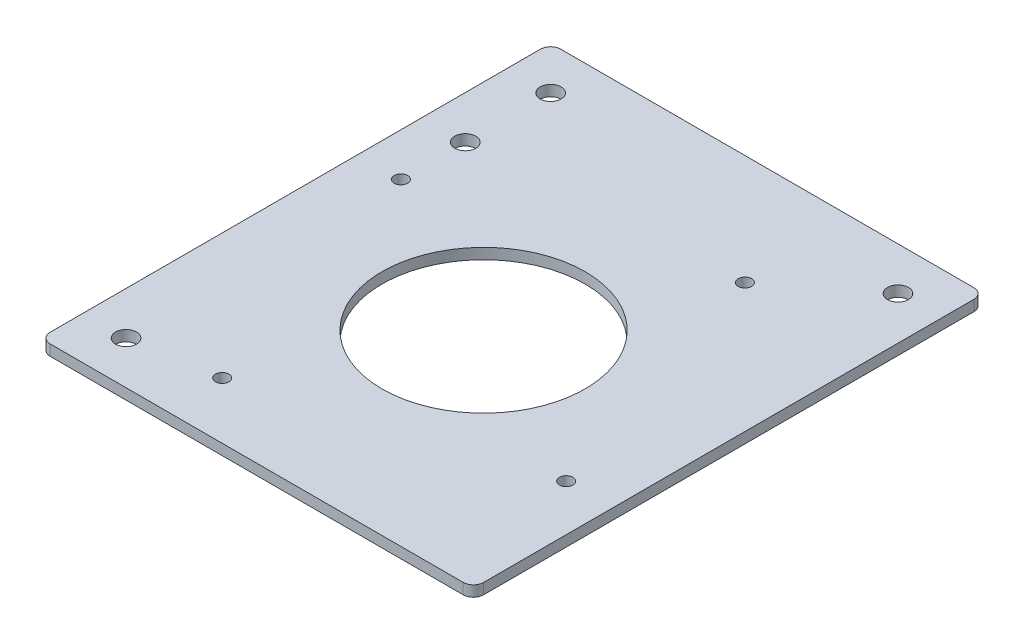
ISO-10303-21;
HEADER;
FILE_DESCRIPTION(('STEP AP214'),'2;1');
FILE_NAME('part.step','',(''),(''),'','','');
FILE_SCHEMA(('AUTOMOTIVE_DESIGN { 1 0 10303 214 1 1 1 1 }'));
ENDSEC;
DATA;
#1=APPLICATION_CONTEXT('core data for automotive mechanical design processes');
#2=APPLICATION_PROTOCOL_DEFINITION('international standard','automotive_design',2000,#1);
#3=PRODUCT_CONTEXT('',#1,'mechanical');
#4=PRODUCT('Part','Part','',(#3));
#5=PRODUCT_RELATED_PRODUCT_CATEGORY('part','',(#4));
#6=PRODUCT_DEFINITION_FORMATION('','',#4);
#7=PRODUCT_DEFINITION_CONTEXT('part definition',#1,'design');
#8=PRODUCT_DEFINITION('design','',#6,#7);
#9=PRODUCT_DEFINITION_SHAPE('','',#8);
#10=(LENGTH_UNIT() NAMED_UNIT(*) SI_UNIT(.MILLI.,.METRE.));
#11=(NAMED_UNIT(*) PLANE_ANGLE_UNIT() SI_UNIT($,.RADIAN.));
#12=(NAMED_UNIT(*) SI_UNIT($,.STERADIAN.) SOLID_ANGLE_UNIT());
#13=UNCERTAINTY_MEASURE_WITH_UNIT(LENGTH_MEASURE(1.E-05),#10,'distance_accuracy_value','');
#14=(GEOMETRIC_REPRESENTATION_CONTEXT(3) GLOBAL_UNCERTAINTY_ASSIGNED_CONTEXT((#13)) GLOBAL_UNIT_ASSIGNED_CONTEXT((#10,
#11,#12)) REPRESENTATION_CONTEXT('',''));
#15=CARTESIAN_POINT('',(0.,0.,0.));
#16=DIRECTION('',(0.,0.,1.));
#17=DIRECTION('',(1.,0.,0.));
#18=AXIS2_PLACEMENT_3D('',#15,#16,#17);
#19=CARTESIAN_POINT('',(0.,3.175,0.));
#20=DIRECTION('',(0.,1.,0.));
#21=DIRECTION('',(0.,0.,1.));
#22=AXIS2_PLACEMENT_3D('',#19,#20,#21);
#23=PLANE('',#22);
#24=CARTESIAN_POINT('',(103.020909069292,3.175,502.462051650955));
#25=DIRECTION('',(0.,1.,0.));
#26=DIRECTION('',(0.,0.,1.));
#27=AXIS2_PLACEMENT_3D('',#24,#25,#26);
#28=CIRCLE('',#27,1.985);
#29=CARTESIAN_POINT('',(103.020909069292,3.175,504.447051650955));
#30=VERTEX_POINT('',#29);
#31=EDGE_CURVE('E281',#30,#30,#28,.T.);
#32=ORIENTED_EDGE('',*,*,#31,.F.);
#33=EDGE_LOOP('',(#32));
#34=FACE_BOUND('',#33,.T.);
#35=CARTESIAN_POINT('',(127.427334093553,3.175,579.655626626706));
#36=DIRECTION('',(0.,1.,0.));
#37=DIRECTION('',(0.,0.,1.));
#38=AXIS2_PLACEMENT_3D('',#35,#36,#37);
#39=CIRCLE('',#38,1.985);
#40=CARTESIAN_POINT('',(127.427334093553,3.175,581.640626626706));
#41=VERTEX_POINT('',#40);
#42=EDGE_CURVE('E277',#41,#41,#39,.T.);
#43=ORIENTED_EDGE('',*,*,#42,.F.);
#44=EDGE_LOOP('',(#43));
#45=FACE_BOUND('',#44,.T.);
#46=CARTESIAN_POINT('',(50.2337591178083,3.175,604.062051650955));
#47=DIRECTION('',(0.,1.,0.));
#48=DIRECTION('',(0.,0.,1.));
#49=AXIS2_PLACEMENT_3D('',#46,#47,#48);
#50=CIRCLE('',#49,1.98500000000004);
#51=CARTESIAN_POINT('',(50.2337591178083,3.175,606.047051650955));
#52=VERTEX_POINT('',#51);
#53=EDGE_CURVE('E269',#52,#52,#50,.T.);
#54=ORIENTED_EDGE('',*,*,#53,.F.);
#55=EDGE_LOOP('',(#54));
#56=FACE_BOUND('',#55,.T.);
#57=CARTESIAN_POINT('',(25.8273340935503,3.175,526.868476675213));
#58=DIRECTION('',(0.,1.,0.));
#59=DIRECTION('',(0.,0.,1.));
#60=AXIS2_PLACEMENT_3D('',#57,#58,#59);
#61=CIRCLE('',#60,1.98499999999998);
#62=CARTESIAN_POINT('',(25.8273340935503,3.175,528.853476675213));
#63=VERTEX_POINT('',#62);
#64=EDGE_CURVE('E261',#63,#63,#61,.T.);
#65=ORIENTED_EDGE('',*,*,#64,.F.);
#66=EDGE_LOOP('',(#65));
#67=FACE_BOUND('',#66,.T.);
#68=CARTESIAN_POINT('',(25.8273340935503,3.175,608.062051650955));
#69=DIRECTION('',(0.,1.,0.));
#70=DIRECTION('',(0.,0.,1.));
#71=AXIS2_PLACEMENT_3D('',#68,#69,#70);
#72=CIRCLE('',#71,3.10000000000006);
#73=CARTESIAN_POINT('',(25.8273340935503,3.175,611.162051650955));
#74=VERTEX_POINT('',#73);
#75=EDGE_CURVE('E237',#74,#74,#72,.T.);
#76=ORIENTED_EDGE('',*,*,#75,.F.);
#77=EDGE_LOOP('',(#76));
#78=FACE_BOUND('',#77,.T.);
#79=CARTESIAN_POINT('',(25.8273340935503,3.175,482.662051650955));
#80=DIRECTION('',(0.,1.,0.));
#81=DIRECTION('',(0.,0.,1.));
#82=AXIS2_PLACEMENT_3D('',#79,#80,#81);
#83=CIRCLE('',#82,3.09999999999998);
#84=CARTESIAN_POINT('',(25.8273340935503,3.175,485.762051650955));
#85=VERTEX_POINT('',#84);
#86=EDGE_CURVE('E221',#85,#85,#83,.T.);
#87=ORIENTED_EDGE('',*,*,#86,.F.);
#88=EDGE_LOOP('',(#87));
#89=FACE_BOUND('',#88,.T.);
#90=DIRECTION('',(0.,0.,-1.));
#91=VECTOR('',#90,1.);
#92=CARTESIAN_POINT('',(141.12733409355,3.175,469.962051650955));
#93=LINE('',#92,#91);
#94=CARTESIAN_POINT('',(141.12733409355,3.175,617.762051650955));
#95=VERTEX_POINT('',#94);
#96=CARTESIAN_POINT('',(141.12733409355,3.175,472.962051650955));
#97=VERTEX_POINT('',#96);
#98=EDGE_CURVE('E160',#95,#97,#93,.T.);
#99=ORIENTED_EDGE('',*,*,#98,.T.);
#100=CARTESIAN_POINT('',(138.12733409355,3.175,472.962051650955));
#101=DIRECTION('',(0.,1.,0.));
#102=DIRECTION('',(0.,0.,1.));
#103=AXIS2_PLACEMENT_3D('',#100,#101,#102);
#104=CIRCLE('',#103,3.);
#105=CARTESIAN_POINT('',(138.12733409355,3.175,469.962051650955));
#106=VERTEX_POINT('',#105);
#107=EDGE_CURVE('E184',#97,#106,#104,.T.);
#108=ORIENTED_EDGE('',*,*,#107,.T.);
#109=DIRECTION('',(-1.,0.,0.));
#110=VECTOR('',#109,1.);
#111=CARTESIAN_POINT('',(13.1273340935502,3.175,469.962051650955));
#112=LINE('',#111,#110);
#113=CARTESIAN_POINT('',(16.1273340935502,3.175,469.962051650955));
#114=VERTEX_POINT('',#113);
#115=EDGE_CURVE('E137',#106,#114,#112,.T.);
#116=ORIENTED_EDGE('',*,*,#115,.T.);
#117=CARTESIAN_POINT('',(16.1273340935502,3.175,472.962051650955));
#118=DIRECTION('',(0.,1.,0.));
#119=DIRECTION('',(0.,0.,1.));
#120=AXIS2_PLACEMENT_3D('',#117,#118,#119);
#121=CIRCLE('',#120,3.);
#122=CARTESIAN_POINT('',(13.1273340935502,3.175,472.962051650955));
#123=VERTEX_POINT('',#122);
#124=EDGE_CURVE('E176',#114,#123,#121,.T.);
#125=ORIENTED_EDGE('',*,*,#124,.T.);
#126=DIRECTION('',(0.,0.,1.));
#127=VECTOR('',#126,1.);
#128=CARTESIAN_POINT('',(13.1273340935502,3.175,469.962051650955));
#129=LINE('',#128,#127);
#130=CARTESIAN_POINT('',(13.1273340935502,3.175,617.762051650955));
#131=VERTEX_POINT('',#130);
#132=EDGE_CURVE('E199',#123,#131,#129,.T.);
#133=ORIENTED_EDGE('',*,*,#132,.T.);
#134=CARTESIAN_POINT('',(16.1273340935502,3.175,617.762051650955));
#135=DIRECTION('',(0.,1.,0.));
#136=DIRECTION('',(0.,0.,1.));
#137=AXIS2_PLACEMENT_3D('',#134,#135,#136);
#138=CIRCLE('',#137,3.);
#139=CARTESIAN_POINT('',(16.1273340935502,3.175,620.762051650955));
#140=VERTEX_POINT('',#139);
#141=EDGE_CURVE('E72',#131,#140,#138,.T.);
#142=ORIENTED_EDGE('',*,*,#141,.T.);
#143=DIRECTION('',(1.,0.,0.));
#144=VECTOR('',#143,1.);
#145=CARTESIAN_POINT('',(13.1273340935502,3.175,620.762051650955));
#146=LINE('',#145,#144);
#147=CARTESIAN_POINT('',(138.12733409355,3.175,620.762051650955));
#148=VERTEX_POINT('',#147);
#149=EDGE_CURVE('E162',#140,#148,#146,.T.);
#150=ORIENTED_EDGE('',*,*,#149,.T.);
#151=CARTESIAN_POINT('',(138.12733409355,3.175,617.762051650955));
#152=DIRECTION('',(0.,1.,0.));
#153=DIRECTION('',(0.,0.,1.));
#154=AXIS2_PLACEMENT_3D('',#151,#152,#153);
#155=CIRCLE('',#154,3.);
#156=EDGE_CURVE('E181',#148,#95,#155,.T.);
#157=ORIENTED_EDGE('',*,*,#156,.T.);
#158=EDGE_LOOP('',(#99,#108,#116,#125,#133,#142,#150,#157));
#159=FACE_BOUND('',#158,.T.);
#160=CARTESIAN_POINT('',(76.6273340935515,3.175,553.26205165096));
#161=DIRECTION('',(0.,1.,0.));
#162=DIRECTION('',(0.,0.,1.));
#163=AXIS2_PLACEMENT_3D('',#160,#161,#162);
#164=CIRCLE('',#163,30.);
#165=CARTESIAN_POINT('',(76.6273340935515,3.175,583.26205165096));
#166=VERTEX_POINT('',#165);
#167=EDGE_CURVE('E154',#166,#166,#164,.T.);
#168=ORIENTED_EDGE('',*,*,#167,.F.);
#169=EDGE_LOOP('',(#168));
#170=FACE_BOUND('',#169,.T.);
#171=CARTESIAN_POINT('',(128.42733409355,3.175,482.662051650955));
#172=DIRECTION('',(0.,1.,0.));
#173=DIRECTION('',(0.,0.,1.));
#174=AXIS2_PLACEMENT_3D('',#171,#172,#173);
#175=CIRCLE('',#174,3.09999999999999);
#176=CARTESIAN_POINT('',(128.42733409355,3.175,485.762051650955));
#177=VERTEX_POINT('',#176);
#178=EDGE_CURVE('E229',#177,#177,#175,.T.);
#179=ORIENTED_EDGE('',*,*,#178,.F.);
#180=EDGE_LOOP('',(#179));
#181=FACE_BOUND('',#180,.T.);
#182=CARTESIAN_POINT('',(25.8273340935503,3.175,507.862051650955));
#183=DIRECTION('',(0.,1.,0.));
#184=DIRECTION('',(0.,0.,1.));
#185=AXIS2_PLACEMENT_3D('',#182,#183,#184);
#186=CIRCLE('',#185,3.09999999999995);
#187=CARTESIAN_POINT('',(25.8273340935503,3.175,510.962051650955));
#188=VERTEX_POINT('',#187);
#189=EDGE_CURVE('E245',#188,#188,#186,.T.);
#190=ORIENTED_EDGE('',*,*,#189,.F.);
#191=EDGE_LOOP('',(#190));
#192=FACE_BOUND('',#191,.T.);
#193=ADVANCED_FACE('F49',(#34,#45,#56,#67,#78,#89,#159,#170,#181,#192),#23,.T.);
#194=CARTESIAN_POINT('',(0.,0.,0.));
#195=DIRECTION('',(0.,1.,0.));
#196=DIRECTION('',(0.,0.,1.));
#197=AXIS2_PLACEMENT_3D('',#194,#195,#196);
#198=PLANE('',#197);
#199=CARTESIAN_POINT('',(103.020909069292,0.,502.462051650955));
#200=DIRECTION('',(0.,1.,0.));
#201=DIRECTION('',(0.,0.,1.));
#202=AXIS2_PLACEMENT_3D('',#199,#200,#201);
#203=CIRCLE('',#202,1.985);
#204=CARTESIAN_POINT('',(103.020909069292,0.,504.447051650955));
#205=VERTEX_POINT('',#204);
#206=EDGE_CURVE('E253',#205,#205,#203,.T.);
#207=ORIENTED_EDGE('',*,*,#206,.T.);
#208=EDGE_LOOP('',(#207));
#209=FACE_BOUND('',#208,.T.);
#210=CARTESIAN_POINT('',(127.427334093553,0.,579.655626626706));
#211=DIRECTION('',(0.,1.,0.));
#212=DIRECTION('',(0.,0.,1.));
#213=AXIS2_PLACEMENT_3D('',#210,#211,#212);
#214=CIRCLE('',#213,1.985);
#215=CARTESIAN_POINT('',(127.427334093553,0.,581.640626626706));
#216=VERTEX_POINT('',#215);
#217=EDGE_CURVE('E273',#216,#216,#214,.T.);
#218=ORIENTED_EDGE('',*,*,#217,.T.);
#219=EDGE_LOOP('',(#218));
#220=FACE_BOUND('',#219,.T.);
#221=CARTESIAN_POINT('',(50.2337591178083,0.,604.062051650955));
#222=DIRECTION('',(0.,1.,0.));
#223=DIRECTION('',(0.,0.,1.));
#224=AXIS2_PLACEMENT_3D('',#221,#222,#223);
#225=CIRCLE('',#224,1.98500000000004);
#226=CARTESIAN_POINT('',(50.2337591178083,0.,606.047051650955));
#227=VERTEX_POINT('',#226);
#228=EDGE_CURVE('E265',#227,#227,#225,.T.);
#229=ORIENTED_EDGE('',*,*,#228,.T.);
#230=EDGE_LOOP('',(#229));
#231=FACE_BOUND('',#230,.T.);
#232=CARTESIAN_POINT('',(25.8273340935503,0.,526.868476675213));
#233=DIRECTION('',(0.,1.,0.));
#234=DIRECTION('',(0.,0.,1.));
#235=AXIS2_PLACEMENT_3D('',#232,#233,#234);
#236=CIRCLE('',#235,1.98499999999998);
#237=CARTESIAN_POINT('',(25.8273340935503,0.,528.853476675213));
#238=VERTEX_POINT('',#237);
#239=EDGE_CURVE('E257',#238,#238,#236,.T.);
#240=ORIENTED_EDGE('',*,*,#239,.T.);
#241=EDGE_LOOP('',(#240));
#242=FACE_BOUND('',#241,.T.);
#243=DIRECTION('',(-1.,0.,0.));
#244=VECTOR('',#243,1.);
#245=CARTESIAN_POINT('',(13.1273340935502,0.,469.962051650955));
#246=LINE('',#245,#244);
#247=CARTESIAN_POINT('',(138.12733409355,0.,469.962051650955));
#248=VERTEX_POINT('',#247);
#249=CARTESIAN_POINT('',(16.1273340935502,0.,469.962051650955));
#250=VERTEX_POINT('',#249);
#251=EDGE_CURVE('E134',#248,#250,#246,.T.);
#252=ORIENTED_EDGE('',*,*,#251,.F.);
#253=CARTESIAN_POINT('',(138.12733409355,0.,472.962051650955));
#254=DIRECTION('',(0.,1.,0.));
#255=DIRECTION('',(0.,0.,1.));
#256=AXIS2_PLACEMENT_3D('',#253,#254,#255);
#257=CIRCLE('',#256,3.);
#258=CARTESIAN_POINT('',(141.12733409355,0.,472.962051650955));
#259=VERTEX_POINT('',#258);
#260=EDGE_CURVE('E116',#248,#259,#257,.F.);
#261=ORIENTED_EDGE('',*,*,#260,.T.);
#262=DIRECTION('',(0.,0.,-1.));
#263=VECTOR('',#262,1.);
#264=CARTESIAN_POINT('',(141.12733409355,0.,469.962051650955));
#265=LINE('',#264,#263);
#266=CARTESIAN_POINT('',(141.12733409355,0.,617.762051650955));
#267=VERTEX_POINT('',#266);
#268=EDGE_CURVE('E147',#267,#259,#265,.T.);
#269=ORIENTED_EDGE('',*,*,#268,.F.);
#270=CARTESIAN_POINT('',(138.12733409355,0.,617.762051650955));
#271=DIRECTION('',(0.,1.,0.));
#272=DIRECTION('',(0.,0.,1.));
#273=AXIS2_PLACEMENT_3D('',#270,#271,#272);
#274=CIRCLE('',#273,3.);
#275=CARTESIAN_POINT('',(138.12733409355,0.,620.762051650955));
#276=VERTEX_POINT('',#275);
#277=EDGE_CURVE('E128',#267,#276,#274,.F.);
#278=ORIENTED_EDGE('',*,*,#277,.T.);
#279=DIRECTION('',(1.,0.,0.));
#280=VECTOR('',#279,1.);
#281=CARTESIAN_POINT('',(13.1273340935502,0.,620.762051650955));
#282=LINE('',#281,#280);
#283=CARTESIAN_POINT('',(16.1273340935502,0.,620.762051650955));
#284=VERTEX_POINT('',#283);
#285=EDGE_CURVE('E152',#284,#276,#282,.T.);
#286=ORIENTED_EDGE('',*,*,#285,.F.);
#287=CARTESIAN_POINT('',(16.1273340935502,0.,617.762051650955));
#288=DIRECTION('',(0.,1.,0.));
#289=DIRECTION('',(0.,0.,1.));
#290=AXIS2_PLACEMENT_3D('',#287,#288,#289);
#291=CIRCLE('',#290,3.);
#292=CARTESIAN_POINT('',(13.1273340935502,0.,617.762051650955));
#293=VERTEX_POINT('',#292);
#294=EDGE_CURVE('E166',#284,#293,#291,.F.);
#295=ORIENTED_EDGE('',*,*,#294,.T.);
#296=DIRECTION('',(0.,0.,1.));
#297=VECTOR('',#296,1.);
#298=CARTESIAN_POINT('',(13.1273340935502,0.,469.962051650955));
#299=LINE('',#298,#297);
#300=CARTESIAN_POINT('',(13.1273340935502,0.,472.962051650955));
#301=VERTEX_POINT('',#300);
#302=EDGE_CURVE('E146',#301,#293,#299,.T.);
#303=ORIENTED_EDGE('',*,*,#302,.F.);
#304=CARTESIAN_POINT('',(16.1273340935502,0.,472.962051650955));
#305=DIRECTION('',(0.,1.,0.));
#306=DIRECTION('',(0.,0.,1.));
#307=AXIS2_PLACEMENT_3D('',#304,#305,#306);
#308=CIRCLE('',#307,3.);
#309=EDGE_CURVE('E139',#301,#250,#308,.F.);
#310=ORIENTED_EDGE('',*,*,#309,.T.);
#311=EDGE_LOOP('',(#252,#261,#269,#278,#286,#295,#303,#310));
#312=FACE_BOUND('',#311,.T.);
#313=CARTESIAN_POINT('',(76.6273340935515,0.,553.26205165096));
#314=DIRECTION('',(0.,1.,0.));
#315=DIRECTION('',(0.,0.,1.));
#316=AXIS2_PLACEMENT_3D('',#313,#314,#315);
#317=CIRCLE('',#316,30.);
#318=CARTESIAN_POINT('',(76.6273340935515,0.,583.26205165096));
#319=VERTEX_POINT('',#318);
#320=EDGE_CURVE('E217',#319,#319,#317,.T.);
#321=ORIENTED_EDGE('',*,*,#320,.T.);
#322=EDGE_LOOP('',(#321));
#323=FACE_BOUND('',#322,.T.);
#324=CARTESIAN_POINT('',(25.8273340935503,0.,482.662051650955));
#325=DIRECTION('',(0.,1.,0.));
#326=DIRECTION('',(0.,0.,1.));
#327=AXIS2_PLACEMENT_3D('',#324,#325,#326);
#328=CIRCLE('',#327,3.09999999999998);
#329=CARTESIAN_POINT('',(25.8273340935503,0.,485.762051650955));
#330=VERTEX_POINT('',#329);
#331=EDGE_CURVE('E225',#330,#330,#328,.T.);
#332=ORIENTED_EDGE('',*,*,#331,.T.);
#333=EDGE_LOOP('',(#332));
#334=FACE_BOUND('',#333,.T.);
#335=CARTESIAN_POINT('',(128.42733409355,0.,482.662051650955));
#336=DIRECTION('',(0.,1.,0.));
#337=DIRECTION('',(0.,0.,1.));
#338=AXIS2_PLACEMENT_3D('',#335,#336,#337);
#339=CIRCLE('',#338,3.09999999999999);
#340=CARTESIAN_POINT('',(128.42733409355,0.,485.762051650955));
#341=VERTEX_POINT('',#340);
#342=EDGE_CURVE('E233',#341,#341,#339,.T.);
#343=ORIENTED_EDGE('',*,*,#342,.T.);
#344=EDGE_LOOP('',(#343));
#345=FACE_BOUND('',#344,.T.);
#346=CARTESIAN_POINT('',(25.8273340935503,0.,608.062051650955));
#347=DIRECTION('',(0.,1.,0.));
#348=DIRECTION('',(0.,0.,1.));
#349=AXIS2_PLACEMENT_3D('',#346,#347,#348);
#350=CIRCLE('',#349,3.10000000000006);
#351=CARTESIAN_POINT('',(25.8273340935503,0.,611.162051650955));
#352=VERTEX_POINT('',#351);
#353=EDGE_CURVE('E241',#352,#352,#350,.T.);
#354=ORIENTED_EDGE('',*,*,#353,.T.);
#355=EDGE_LOOP('',(#354));
#356=FACE_BOUND('',#355,.T.);
#357=CARTESIAN_POINT('',(25.8273340935503,0.,507.862051650955));
#358=DIRECTION('',(0.,1.,0.));
#359=DIRECTION('',(0.,0.,1.));
#360=AXIS2_PLACEMENT_3D('',#357,#358,#359);
#361=CIRCLE('',#360,3.09999999999995);
#362=CARTESIAN_POINT('',(25.8273340935503,0.,510.962051650955));
#363=VERTEX_POINT('',#362);
#364=EDGE_CURVE('E249',#363,#363,#361,.T.);
#365=ORIENTED_EDGE('',*,*,#364,.T.);
#366=EDGE_LOOP('',(#365));
#367=FACE_BOUND('',#366,.T.);
#368=ADVANCED_FACE('F142',(#209,#220,#231,#242,#312,#323,#334,#345,#356,#367),#198,.F.);
#369=CARTESIAN_POINT('',(141.12733409355,3.175,469.962051650955));
#370=DIRECTION('',(-1.,0.,0.));
#371=DIRECTION('',(0.,0.,1.));
#372=AXIS2_PLACEMENT_3D('',#369,#370,#371);
#373=PLANE('',#372);
#374=ORIENTED_EDGE('',*,*,#268,.T.);
#375=DIRECTION('',(0.,-1.,0.));
#376=VECTOR('',#375,1.);
#377=CARTESIAN_POINT('',(141.12733409355,3.175,472.962051650955));
#378=LINE('',#377,#376);
#379=EDGE_CURVE('E121',#259,#97,#378,.F.);
#380=ORIENTED_EDGE('',*,*,#379,.T.);
#381=ORIENTED_EDGE('',*,*,#98,.F.);
#382=DIRECTION('',(0.,-1.,0.));
#383=VECTOR('',#382,1.);
#384=CARTESIAN_POINT('',(141.12733409355,3.175,617.762051650955));
#385=LINE('',#384,#383);
#386=EDGE_CURVE('E127',#95,#267,#385,.T.);
#387=ORIENTED_EDGE('',*,*,#386,.T.);
#388=EDGE_LOOP('',(#374,#380,#381,#387));
#389=FACE_BOUND('',#388,.T.);
#390=ADVANCED_FACE('F326',(#389),#373,.F.);
#391=CARTESIAN_POINT('',(13.1273340935502,3.175,469.962051650955));
#392=DIRECTION('',(0.,0.,1.));
#393=DIRECTION('',(1.,0.,0.));
#394=AXIS2_PLACEMENT_3D('',#391,#392,#393);
#395=PLANE('',#394);
#396=ORIENTED_EDGE('',*,*,#115,.F.);
#397=DIRECTION('',(0.,-1.,0.));
#398=VECTOR('',#397,1.);
#399=CARTESIAN_POINT('',(138.12733409355,3.175,469.962051650955));
#400=LINE('',#399,#398);
#401=EDGE_CURVE('E120',#106,#248,#400,.T.);
#402=ORIENTED_EDGE('',*,*,#401,.T.);
#403=ORIENTED_EDGE('',*,*,#251,.T.);
#404=DIRECTION('',(0.,-1.,0.));
#405=VECTOR('',#404,1.);
#406=CARTESIAN_POINT('',(16.1273340935502,3.175,469.962051650955));
#407=LINE('',#406,#405);
#408=EDGE_CURVE('E140',#250,#114,#407,.F.);
#409=ORIENTED_EDGE('',*,*,#408,.T.);
#410=EDGE_LOOP('',(#396,#402,#403,#409));
#411=FACE_BOUND('',#410,.T.);
#412=ADVANCED_FACE('F133',(#411),#395,.F.);
#413=CARTESIAN_POINT('',(13.1273340935502,3.175,469.962051650955));
#414=DIRECTION('',(1.,0.,0.));
#415=DIRECTION('',(0.,0.,-1.));
#416=AXIS2_PLACEMENT_3D('',#413,#414,#415);
#417=PLANE('',#416);
#418=ORIENTED_EDGE('',*,*,#302,.T.);
#419=DIRECTION('',(0.,-1.,0.));
#420=VECTOR('',#419,1.);
#421=CARTESIAN_POINT('',(13.1273340935502,3.175,617.762051650955));
#422=LINE('',#421,#420);
#423=EDGE_CURVE('E11',#293,#131,#422,.F.);
#424=ORIENTED_EDGE('',*,*,#423,.T.);
#425=ORIENTED_EDGE('',*,*,#132,.F.);
#426=DIRECTION('',(0.,-1.,0.));
#427=VECTOR('',#426,1.);
#428=CARTESIAN_POINT('',(13.1273340935502,3.175,472.962051650955));
#429=LINE('',#428,#427);
#430=EDGE_CURVE('E58',#123,#301,#429,.T.);
#431=ORIENTED_EDGE('',*,*,#430,.T.);
#432=EDGE_LOOP('',(#418,#424,#425,#431));
#433=FACE_BOUND('',#432,.T.);
#434=ADVANCED_FACE('F197',(#433),#417,.F.);
#435=CARTESIAN_POINT('',(13.1273340935502,3.175,620.762051650955));
#436=DIRECTION('',(0.,0.,-1.));
#437=DIRECTION('',(-1.,0.,0.));
#438=AXIS2_PLACEMENT_3D('',#435,#436,#437);
#439=PLANE('',#438);
#440=ORIENTED_EDGE('',*,*,#285,.T.);
#441=DIRECTION('',(0.,-1.,0.));
#442=VECTOR('',#441,1.);
#443=CARTESIAN_POINT('',(138.12733409355,3.175,620.762051650955));
#444=LINE('',#443,#442);
#445=EDGE_CURVE('E65',#276,#148,#444,.F.);
#446=ORIENTED_EDGE('',*,*,#445,.T.);
#447=ORIENTED_EDGE('',*,*,#149,.F.);
#448=DIRECTION('',(0.,-1.,0.));
#449=VECTOR('',#448,1.);
#450=CARTESIAN_POINT('',(16.1273340935502,3.175,620.762051650955));
#451=LINE('',#450,#449);
#452=EDGE_CURVE('E187',#140,#284,#451,.T.);
#453=ORIENTED_EDGE('',*,*,#452,.T.);
#454=EDGE_LOOP('',(#440,#446,#447,#453));
#455=FACE_BOUND('',#454,.T.);
#456=ADVANCED_FACE('F206',(#455),#439,.F.);
#457=CARTESIAN_POINT('',(76.6273340935515,3.175,553.26205165096));
#458=DIRECTION('',(0.,-1.,0.));
#459=DIRECTION('',(0.,0.,-1.));
#460=AXIS2_PLACEMENT_3D('',#457,#458,#459);
#461=CYLINDRICAL_SURFACE('',#460,30.);
#462=ORIENTED_EDGE('',*,*,#167,.T.);
#463=EDGE_LOOP('',(#462));
#464=FACE_BOUND('',#463,.T.);
#465=ORIENTED_EDGE('',*,*,#320,.F.);
#466=EDGE_LOOP('',(#465));
#467=FACE_BOUND('',#466,.T.);
#468=ADVANCED_FACE('F338',(#464,#467),#461,.F.);
#469=CARTESIAN_POINT('',(25.8273340935503,3.175,482.662051650955));
#470=DIRECTION('',(0.,-1.,0.));
#471=DIRECTION('',(0.,0.,-1.));
#472=AXIS2_PLACEMENT_3D('',#469,#470,#471);
#473=CYLINDRICAL_SURFACE('',#472,3.09999999999998);
#474=ORIENTED_EDGE('',*,*,#86,.T.);
#475=EDGE_LOOP('',(#474));
#476=FACE_BOUND('',#475,.T.);
#477=ORIENTED_EDGE('',*,*,#331,.F.);
#478=EDGE_LOOP('',(#477));
#479=FACE_BOUND('',#478,.T.);
#480=ADVANCED_FACE('F373',(#476,#479),#473,.F.);
#481=CARTESIAN_POINT('',(128.42733409355,3.175,482.662051650955));
#482=DIRECTION('',(0.,-1.,0.));
#483=DIRECTION('',(0.,0.,-1.));
#484=AXIS2_PLACEMENT_3D('',#481,#482,#483);
#485=CYLINDRICAL_SURFACE('',#484,3.09999999999999);
#486=ORIENTED_EDGE('',*,*,#178,.T.);
#487=EDGE_LOOP('',(#486));
#488=FACE_BOUND('',#487,.T.);
#489=ORIENTED_EDGE('',*,*,#342,.F.);
#490=EDGE_LOOP('',(#489));
#491=FACE_BOUND('',#490,.T.);
#492=ADVANCED_FACE('F369',(#488,#491),#485,.F.);
#493=CARTESIAN_POINT('',(25.8273340935503,3.175,608.062051650955));
#494=DIRECTION('',(0.,-1.,0.));
#495=DIRECTION('',(0.,0.,-1.));
#496=AXIS2_PLACEMENT_3D('',#493,#494,#495);
#497=CYLINDRICAL_SURFACE('',#496,3.10000000000006);
#498=ORIENTED_EDGE('',*,*,#75,.T.);
#499=EDGE_LOOP('',(#498));
#500=FACE_BOUND('',#499,.T.);
#501=ORIENTED_EDGE('',*,*,#353,.F.);
#502=EDGE_LOOP('',(#501));
#503=FACE_BOUND('',#502,.T.);
#504=ADVANCED_FACE('F321',(#500,#503),#497,.F.);
#505=CARTESIAN_POINT('',(25.8273340935503,3.175,507.862051650955));
#506=DIRECTION('',(0.,-1.,0.));
#507=DIRECTION('',(0.,0.,-1.));
#508=AXIS2_PLACEMENT_3D('',#505,#506,#507);
#509=CYLINDRICAL_SURFACE('',#508,3.09999999999995);
#510=ORIENTED_EDGE('',*,*,#189,.T.);
#511=EDGE_LOOP('',(#510));
#512=FACE_BOUND('',#511,.T.);
#513=ORIENTED_EDGE('',*,*,#364,.F.);
#514=EDGE_LOOP('',(#513));
#515=FACE_BOUND('',#514,.T.);
#516=ADVANCED_FACE('F318',(#512,#515),#509,.F.);
#517=CARTESIAN_POINT('',(138.12733409355,3.175,472.962051650955));
#518=DIRECTION('',(0.,-1.,0.));
#519=DIRECTION('',(0.,0.,-1.));
#520=AXIS2_PLACEMENT_3D('',#517,#518,#519);
#521=CYLINDRICAL_SURFACE('',#520,3.);
#522=ORIENTED_EDGE('',*,*,#107,.F.);
#523=ORIENTED_EDGE('',*,*,#379,.F.);
#524=ORIENTED_EDGE('',*,*,#260,.F.);
#525=ORIENTED_EDGE('',*,*,#401,.F.);
#526=EDGE_LOOP('',(#522,#523,#524,#525));
#527=FACE_BOUND('',#526,.T.);
#528=ADVANCED_FACE('F119',(#527),#521,.T.);
#529=CARTESIAN_POINT('',(138.12733409355,3.175,617.762051650955));
#530=DIRECTION('',(0.,-1.,0.));
#531=DIRECTION('',(0.,0.,-1.));
#532=AXIS2_PLACEMENT_3D('',#529,#530,#531);
#533=CYLINDRICAL_SURFACE('',#532,3.);
#534=ORIENTED_EDGE('',*,*,#156,.F.);
#535=ORIENTED_EDGE('',*,*,#445,.F.);
#536=ORIENTED_EDGE('',*,*,#277,.F.);
#537=ORIENTED_EDGE('',*,*,#386,.F.);
#538=EDGE_LOOP('',(#534,#535,#536,#537));
#539=FACE_BOUND('',#538,.T.);
#540=ADVANCED_FACE('F345',(#539),#533,.T.);
#541=CARTESIAN_POINT('',(16.1273340935502,3.175,617.762051650955));
#542=DIRECTION('',(0.,-1.,0.));
#543=DIRECTION('',(0.,0.,-1.));
#544=AXIS2_PLACEMENT_3D('',#541,#542,#543);
#545=CYLINDRICAL_SURFACE('',#544,3.);
#546=ORIENTED_EDGE('',*,*,#141,.F.);
#547=ORIENTED_EDGE('',*,*,#423,.F.);
#548=ORIENTED_EDGE('',*,*,#294,.F.);
#549=ORIENTED_EDGE('',*,*,#452,.F.);
#550=EDGE_LOOP('',(#546,#547,#548,#549));
#551=FACE_BOUND('',#550,.T.);
#552=ADVANCED_FACE('F205',(#551),#545,.T.);
#553=CARTESIAN_POINT('',(16.1273340935502,3.175,472.962051650955));
#554=DIRECTION('',(0.,-1.,0.));
#555=DIRECTION('',(0.,0.,-1.));
#556=AXIS2_PLACEMENT_3D('',#553,#554,#555);
#557=CYLINDRICAL_SURFACE('',#556,3.);
#558=ORIENTED_EDGE('',*,*,#124,.F.);
#559=ORIENTED_EDGE('',*,*,#408,.F.);
#560=ORIENTED_EDGE('',*,*,#309,.F.);
#561=ORIENTED_EDGE('',*,*,#430,.F.);
#562=EDGE_LOOP('',(#558,#559,#560,#561));
#563=FACE_BOUND('',#562,.T.);
#564=ADVANCED_FACE('F51',(#563),#557,.T.);
#565=CARTESIAN_POINT('',(25.8273340935503,0.,526.868476675213));
#566=DIRECTION('',(0.,1.,0.));
#567=DIRECTION('',(0.,0.,1.));
#568=AXIS2_PLACEMENT_3D('',#565,#566,#567);
#569=CYLINDRICAL_SURFACE('',#568,1.98499999999998);
#570=ORIENTED_EDGE('',*,*,#239,.F.);
#571=EDGE_LOOP('',(#570));
#572=FACE_BOUND('',#571,.T.);
#573=ORIENTED_EDGE('',*,*,#64,.T.);
#574=EDGE_LOOP('',(#573));
#575=FACE_BOUND('',#574,.T.);
#576=ADVANCED_FACE('F352',(#572,#575),#569,.F.);
#577=CARTESIAN_POINT('',(50.2337591178083,0.,604.062051650955));
#578=DIRECTION('',(0.,1.,0.));
#579=DIRECTION('',(0.,0.,1.));
#580=AXIS2_PLACEMENT_3D('',#577,#578,#579);
#581=CYLINDRICAL_SURFACE('',#580,1.98500000000004);
#582=ORIENTED_EDGE('',*,*,#228,.F.);
#583=EDGE_LOOP('',(#582));
#584=FACE_BOUND('',#583,.T.);
#585=ORIENTED_EDGE('',*,*,#53,.T.);
#586=EDGE_LOOP('',(#585));
#587=FACE_BOUND('',#586,.T.);
#588=ADVANCED_FACE('F355',(#584,#587),#581,.F.);
#589=CARTESIAN_POINT('',(127.427334093553,0.,579.655626626706));
#590=DIRECTION('',(0.,1.,0.));
#591=DIRECTION('',(0.,0.,1.));
#592=AXIS2_PLACEMENT_3D('',#589,#590,#591);
#593=CYLINDRICAL_SURFACE('',#592,1.985);
#594=ORIENTED_EDGE('',*,*,#217,.F.);
#595=EDGE_LOOP('',(#594));
#596=FACE_BOUND('',#595,.T.);
#597=ORIENTED_EDGE('',*,*,#42,.T.);
#598=EDGE_LOOP('',(#597));
#599=FACE_BOUND('',#598,.T.);
#600=ADVANCED_FACE('F294',(#596,#599),#593,.F.);
#601=CARTESIAN_POINT('',(103.020909069292,0.,502.462051650955));
#602=DIRECTION('',(0.,1.,0.));
#603=DIRECTION('',(0.,0.,1.));
#604=AXIS2_PLACEMENT_3D('',#601,#602,#603);
#605=CYLINDRICAL_SURFACE('',#604,1.985);
#606=ORIENTED_EDGE('',*,*,#206,.F.);
#607=EDGE_LOOP('',(#606));
#608=FACE_BOUND('',#607,.T.);
#609=ORIENTED_EDGE('',*,*,#31,.T.);
#610=EDGE_LOOP('',(#609));
#611=FACE_BOUND('',#610,.T.);
#612=ADVANCED_FACE('F291',(#608,#611),#605,.F.);
#613=CLOSED_SHELL('',(#193,#368,#390,#412,#434,#456,#468,#480,#492,#504,#516,#528,#540,#552,
#564,#576,#588,#600,#612));
#614=MANIFOLD_SOLID_BREP('B2',#613);
#615=ADVANCED_BREP_SHAPE_REPRESENTATION('',(#18,#614),#14);
#616=SHAPE_DEFINITION_REPRESENTATION(#9,#615);
ENDSEC;
END-ISO-10303-21;
